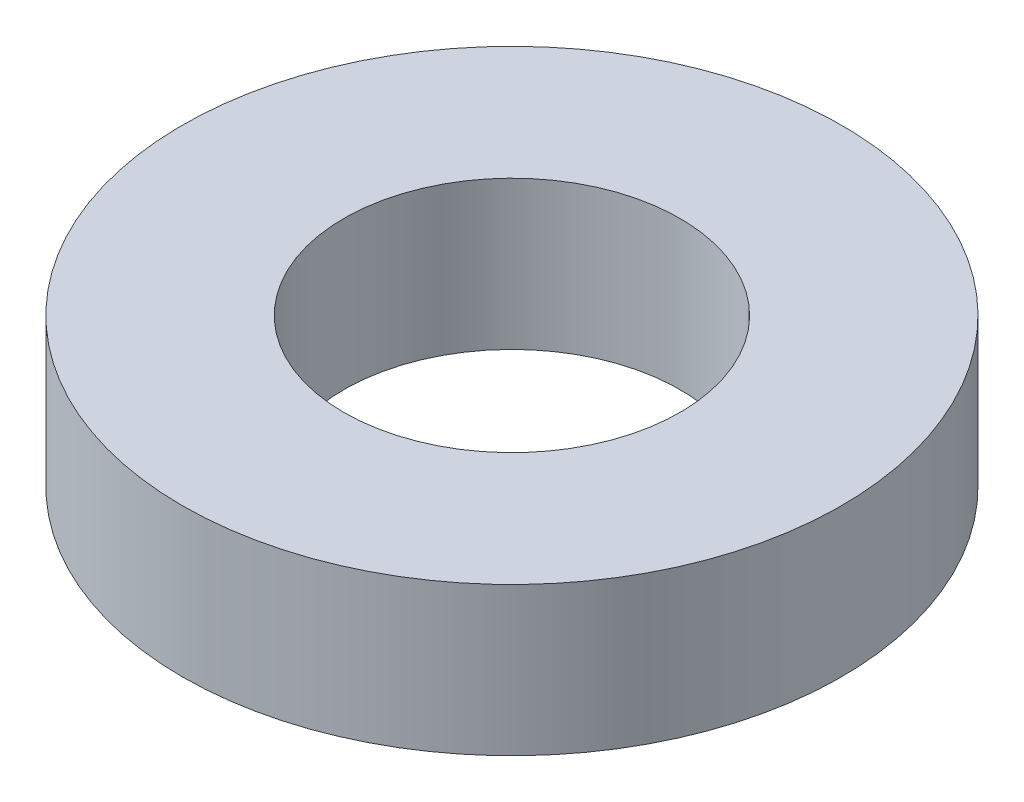
ISO-10303-21;
HEADER;
FILE_DESCRIPTION(('STEP AP214'),'2;1');
FILE_NAME('part.step','',(''),(''),'','','');
FILE_SCHEMA(('AUTOMOTIVE_DESIGN { 1 0 10303 214 1 1 1 1 }'));
ENDSEC;
DATA;
#1=APPLICATION_CONTEXT('core data for automotive mechanical design processes');
#2=APPLICATION_PROTOCOL_DEFINITION('international standard','automotive_design',2000,#1);
#3=PRODUCT_CONTEXT('',#1,'mechanical');
#4=PRODUCT('Part','Part','',(#3));
#5=PRODUCT_RELATED_PRODUCT_CATEGORY('part','',(#4));
#6=PRODUCT_DEFINITION_FORMATION('','',#4);
#7=PRODUCT_DEFINITION_CONTEXT('part definition',#1,'design');
#8=PRODUCT_DEFINITION('design','',#6,#7);
#9=PRODUCT_DEFINITION_SHAPE('','',#8);
#10=(LENGTH_UNIT() NAMED_UNIT(*) SI_UNIT(.MILLI.,.METRE.));
#11=(NAMED_UNIT(*) PLANE_ANGLE_UNIT() SI_UNIT($,.RADIAN.));
#12=(NAMED_UNIT(*) SI_UNIT($,.STERADIAN.) SOLID_ANGLE_UNIT());
#13=UNCERTAINTY_MEASURE_WITH_UNIT(LENGTH_MEASURE(1.E-05),#10,'distance_accuracy_value','');
#14=(GEOMETRIC_REPRESENTATION_CONTEXT(3) GLOBAL_UNCERTAINTY_ASSIGNED_CONTEXT((#13)) GLOBAL_UNIT_ASSIGNED_CONTEXT((#10,
#11,#12)) REPRESENTATION_CONTEXT('',''));
#15=CARTESIAN_POINT('',(0.,0.,0.));
#16=DIRECTION('',(0.,0.,1.));
#17=DIRECTION('',(1.,0.,0.));
#18=AXIS2_PLACEMENT_3D('',#15,#16,#17);
#19=CARTESIAN_POINT('',(0.,2.25,0.));
#20=DIRECTION('',(0.,1.,0.));
#21=DIRECTION('',(0.,0.,1.));
#22=AXIS2_PLACEMENT_3D('',#19,#20,#21);
#23=PLANE('',#22);
#24=CARTESIAN_POINT('',(0.,2.25,0.));
#25=DIRECTION('',(0.,1.,0.));
#26=DIRECTION('',(0.,0.,1.));
#27=AXIS2_PLACEMENT_3D('',#24,#25,#26);
#28=CIRCLE('',#27,5.);
#29=CARTESIAN_POINT('',(0.,2.25,5.));
#30=VERTEX_POINT('',#29);
#31=EDGE_CURVE('E10',#30,#30,#28,.T.);
#32=ORIENTED_EDGE('',*,*,#31,.T.);
#33=EDGE_LOOP('',(#32));
#34=FACE_BOUND('',#33,.T.);
#35=CARTESIAN_POINT('',(0.,2.25,0.));
#36=DIRECTION('',(0.,1.,0.));
#37=DIRECTION('',(0.,0.,1.));
#38=AXIS2_PLACEMENT_3D('',#35,#36,#37);
#39=CIRCLE('',#38,2.55);
#40=CARTESIAN_POINT('',(0.,2.25,2.55));
#41=VERTEX_POINT('',#40);
#42=EDGE_CURVE('E50',#41,#41,#39,.T.);
#43=ORIENTED_EDGE('',*,*,#42,.F.);
#44=EDGE_LOOP('',(#43));
#45=FACE_BOUND('',#44,.T.);
#46=ADVANCED_FACE('F37',(#34,#45),#23,.T.);
#47=CARTESIAN_POINT('',(0.,0.,0.));
#48=DIRECTION('',(0.,1.,0.));
#49=DIRECTION('',(0.,0.,1.));
#50=AXIS2_PLACEMENT_3D('',#47,#48,#49);
#51=PLANE('',#50);
#52=CARTESIAN_POINT('',(0.,0.,0.));
#53=DIRECTION('',(0.,1.,0.));
#54=DIRECTION('',(0.,0.,1.));
#55=AXIS2_PLACEMENT_3D('',#52,#53,#54);
#56=CIRCLE('',#55,5.);
#57=CARTESIAN_POINT('',(0.,0.,5.));
#58=VERTEX_POINT('',#57);
#59=EDGE_CURVE('E41',#58,#58,#56,.T.);
#60=ORIENTED_EDGE('',*,*,#59,.F.);
#61=EDGE_LOOP('',(#60));
#62=FACE_BOUND('',#61,.T.);
#63=CARTESIAN_POINT('',(0.,0.,0.));
#64=DIRECTION('',(0.,1.,0.));
#65=DIRECTION('',(0.,0.,1.));
#66=AXIS2_PLACEMENT_3D('',#63,#64,#65);
#67=CIRCLE('',#66,2.55);
#68=CARTESIAN_POINT('',(0.,0.,2.55));
#69=VERTEX_POINT('',#68);
#70=EDGE_CURVE('E52',#69,#69,#67,.T.);
#71=ORIENTED_EDGE('',*,*,#70,.T.);
#72=EDGE_LOOP('',(#71));
#73=FACE_BOUND('',#72,.T.);
#74=ADVANCED_FACE('F64',(#62,#73),#51,.F.);
#75=CARTESIAN_POINT('',(0.,2.25,0.));
#76=DIRECTION('',(0.,-1.,0.));
#77=DIRECTION('',(0.,0.,-1.));
#78=AXIS2_PLACEMENT_3D('',#75,#76,#77);
#79=CYLINDRICAL_SURFACE('',#78,5.);
#80=ORIENTED_EDGE('',*,*,#31,.F.);
#81=EDGE_LOOP('',(#80));
#82=FACE_BOUND('',#81,.T.);
#83=ORIENTED_EDGE('',*,*,#59,.T.);
#84=EDGE_LOOP('',(#83));
#85=FACE_BOUND('',#84,.T.);
#86=ADVANCED_FACE('F39',(#82,#85),#79,.T.);
#87=CARTESIAN_POINT('',(0.,2.25,0.));
#88=DIRECTION('',(0.,-1.,0.));
#89=DIRECTION('',(0.,0.,-1.));
#90=AXIS2_PLACEMENT_3D('',#87,#88,#89);
#91=CYLINDRICAL_SURFACE('',#90,2.55);
#92=ORIENTED_EDGE('',*,*,#42,.T.);
#93=EDGE_LOOP('',(#92));
#94=FACE_BOUND('',#93,.T.);
#95=ORIENTED_EDGE('',*,*,#70,.F.);
#96=EDGE_LOOP('',(#95));
#97=FACE_BOUND('',#96,.T.);
#98=ADVANCED_FACE('F60',(#94,#97),#91,.F.);
#99=CLOSED_SHELL('',(#46,#74,#86,#98));
#100=MANIFOLD_SOLID_BREP('B2',#99);
#101=ADVANCED_BREP_SHAPE_REPRESENTATION('',(#18,#100),#14);
#102=SHAPE_DEFINITION_REPRESENTATION(#9,#101);
ENDSEC;
END-ISO-10303-21;
